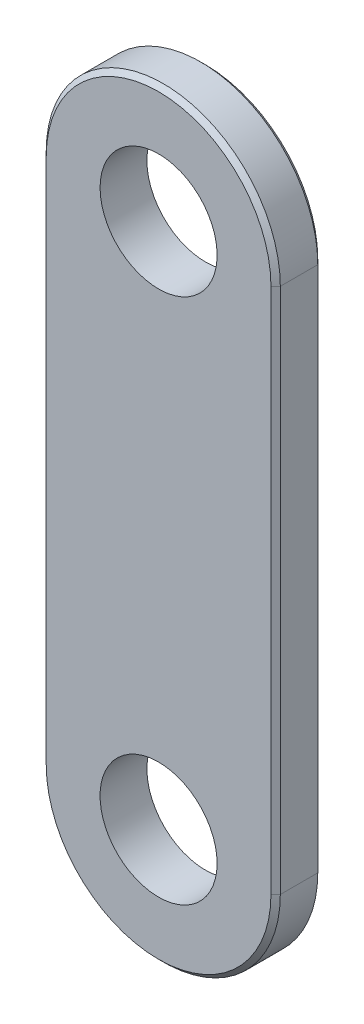
ISO-10303-21;
HEADER;
FILE_DESCRIPTION(('STEP AP214'),'2;1');
FILE_NAME('part.step','',(''),(''),'','','');
FILE_SCHEMA(('AUTOMOTIVE_DESIGN { 1 0 10303 214 1 1 1 1 }'));
ENDSEC;
DATA;
#1=APPLICATION_CONTEXT('core data for automotive mechanical design processes');
#2=APPLICATION_PROTOCOL_DEFINITION('international standard','automotive_design',2000,#1);
#3=PRODUCT_CONTEXT('',#1,'mechanical');
#4=PRODUCT('Part','Part','',(#3));
#5=PRODUCT_RELATED_PRODUCT_CATEGORY('part','',(#4));
#6=PRODUCT_DEFINITION_FORMATION('','',#4);
#7=PRODUCT_DEFINITION_CONTEXT('part definition',#1,'design');
#8=PRODUCT_DEFINITION('design','',#6,#7);
#9=PRODUCT_DEFINITION_SHAPE('','',#8);
#10=(LENGTH_UNIT() NAMED_UNIT(*) SI_UNIT(.MILLI.,.METRE.));
#11=(NAMED_UNIT(*) PLANE_ANGLE_UNIT() SI_UNIT($,.RADIAN.));
#12=(NAMED_UNIT(*) SI_UNIT($,.STERADIAN.) SOLID_ANGLE_UNIT());
#13=UNCERTAINTY_MEASURE_WITH_UNIT(LENGTH_MEASURE(1.E-05),#10,'distance_accuracy_value','');
#14=(GEOMETRIC_REPRESENTATION_CONTEXT(3) GLOBAL_UNCERTAINTY_ASSIGNED_CONTEXT((#13)) GLOBAL_UNIT_ASSIGNED_CONTEXT((#10,
#11,#12)) REPRESENTATION_CONTEXT('',''));
#15=CARTESIAN_POINT('',(0.,0.,0.));
#16=DIRECTION('',(0.,0.,1.));
#17=DIRECTION('',(1.,0.,0.));
#18=AXIS2_PLACEMENT_3D('',#15,#16,#17);
#19=CARTESIAN_POINT('',(0.,0.,-10.));
#20=DIRECTION('',(0.,0.,1.));
#21=DIRECTION('',(1.,0.,0.));
#22=AXIS2_PLACEMENT_3D('',#19,#20,#21);
#23=CYLINDRICAL_SURFACE('',#22,50.);
#24=DIRECTION('',(0.,0.,1.));
#25=VECTOR('',#24,1.);
#26=CARTESIAN_POINT('',(-50.,0.,-10.));
#27=LINE('',#26,#25);
#28=CARTESIAN_POINT('',(-50.,0.,-8.00000000000003));
#29=VERTEX_POINT('',#28);
#30=CARTESIAN_POINT('',(-50.,0.,7.99999999999996));
#31=VERTEX_POINT('',#30);
#32=EDGE_CURVE('E142',#29,#31,#27,.T.);
#33=ORIENTED_EDGE('',*,*,#32,.F.);
#34=CARTESIAN_POINT('',(0.,0.,-8.00000000000003));
#35=DIRECTION('',(0.,0.,1.));
#36=DIRECTION('',(1.,0.,0.));
#37=AXIS2_PLACEMENT_3D('',#34,#35,#36);
#38=CIRCLE('',#37,50.);
#39=CARTESIAN_POINT('',(50.,0.,-8.00000000000003));
#40=VERTEX_POINT('',#39);
#41=EDGE_CURVE('E126',#29,#40,#38,.T.);
#42=ORIENTED_EDGE('',*,*,#41,.T.);
#43=DIRECTION('',(0.,0.,1.));
#44=VECTOR('',#43,1.);
#45=CARTESIAN_POINT('',(50.,0.,-10.));
#46=LINE('',#45,#44);
#47=CARTESIAN_POINT('',(50.,0.,7.99999999999996));
#48=VERTEX_POINT('',#47);
#49=EDGE_CURVE('E165',#40,#48,#46,.T.);
#50=ORIENTED_EDGE('',*,*,#49,.T.);
#51=CARTESIAN_POINT('',(0.,0.,7.99999999999996));
#52=DIRECTION('',(0.,0.,1.));
#53=DIRECTION('',(1.,0.,0.));
#54=AXIS2_PLACEMENT_3D('',#51,#52,#53);
#55=CIRCLE('',#54,50.);
#56=EDGE_CURVE('E136',#48,#31,#55,.F.);
#57=ORIENTED_EDGE('',*,*,#56,.T.);
#58=EDGE_LOOP('',(#33,#42,#50,#57));
#59=FACE_BOUND('',#58,.T.);
#60=ADVANCED_FACE('F41',(#59),#23,.T.);
#61=CARTESIAN_POINT('',(-50.,0.,-10.));
#62=DIRECTION('',(-1.,0.,0.));
#63=DIRECTION('',(0.,0.,1.));
#64=AXIS2_PLACEMENT_3D('',#61,#62,#63);
#65=PLANE('',#64);
#66=DIRECTION('',(0.,0.,1.));
#67=VECTOR('',#66,1.);
#68=CARTESIAN_POINT('',(-50.,225.,-10.));
#69=LINE('',#68,#67);
#70=CARTESIAN_POINT('',(-50.,225.,-8.00000000000003));
#71=VERTEX_POINT('',#70);
#72=CARTESIAN_POINT('',(-50.,225.,7.99999999999996));
#73=VERTEX_POINT('',#72);
#74=EDGE_CURVE('E144',#71,#73,#69,.T.);
#75=ORIENTED_EDGE('',*,*,#74,.F.);
#76=DIRECTION('',(0.,-1.,0.));
#77=VECTOR('',#76,1.);
#78=CARTESIAN_POINT('',(-50.,0.,-8.00000000000003));
#79=LINE('',#78,#77);
#80=EDGE_CURVE('E117',#71,#29,#79,.T.);
#81=ORIENTED_EDGE('',*,*,#80,.T.);
#82=ORIENTED_EDGE('',*,*,#32,.T.);
#83=DIRECTION('',(0.,1.,0.));
#84=VECTOR('',#83,1.);
#85=CARTESIAN_POINT('',(-50.,0.,7.99999999999996));
#86=LINE('',#85,#84);
#87=EDGE_CURVE('E148',#31,#73,#86,.T.);
#88=ORIENTED_EDGE('',*,*,#87,.T.);
#89=EDGE_LOOP('',(#75,#81,#82,#88));
#90=FACE_BOUND('',#89,.T.);
#91=ADVANCED_FACE('F141',(#90),#65,.T.);
#92=CARTESIAN_POINT('',(0.,225.,-10.));
#93=DIRECTION('',(0.,0.,1.));
#94=DIRECTION('',(1.,0.,0.));
#95=AXIS2_PLACEMENT_3D('',#92,#93,#94);
#96=CYLINDRICAL_SURFACE('',#95,50.);
#97=DIRECTION('',(0.,0.,1.));
#98=VECTOR('',#97,1.);
#99=CARTESIAN_POINT('',(50.,225.,-10.));
#100=LINE('',#99,#98);
#101=CARTESIAN_POINT('',(50.,225.,-8.00000000000003));
#102=VERTEX_POINT('',#101);
#103=CARTESIAN_POINT('',(50.,225.,7.99999999999996));
#104=VERTEX_POINT('',#103);
#105=EDGE_CURVE('E156',#102,#104,#100,.T.);
#106=ORIENTED_EDGE('',*,*,#105,.F.);
#107=CARTESIAN_POINT('',(0.,225.,-8.00000000000003));
#108=DIRECTION('',(0.,0.,1.));
#109=DIRECTION('',(1.,0.,0.));
#110=AXIS2_PLACEMENT_3D('',#107,#108,#109);
#111=CIRCLE('',#110,50.);
#112=EDGE_CURVE('E182',#102,#71,#111,.T.);
#113=ORIENTED_EDGE('',*,*,#112,.T.);
#114=ORIENTED_EDGE('',*,*,#74,.T.);
#115=CARTESIAN_POINT('',(0.,225.,7.99999999999996));
#116=DIRECTION('',(0.,0.,1.));
#117=DIRECTION('',(1.,0.,0.));
#118=AXIS2_PLACEMENT_3D('',#115,#116,#117);
#119=CIRCLE('',#118,50.);
#120=EDGE_CURVE('E135',#73,#104,#119,.F.);
#121=ORIENTED_EDGE('',*,*,#120,.T.);
#122=EDGE_LOOP('',(#106,#113,#114,#121));
#123=FACE_BOUND('',#122,.T.);
#124=ADVANCED_FACE('F228',(#123),#96,.T.);
#125=CARTESIAN_POINT('',(50.,0.,-10.));
#126=DIRECTION('',(1.,0.,0.));
#127=DIRECTION('',(0.,0.,-1.));
#128=AXIS2_PLACEMENT_3D('',#125,#126,#127);
#129=PLANE('',#128);
#130=ORIENTED_EDGE('',*,*,#49,.F.);
#131=DIRECTION('',(0.,1.,0.));
#132=VECTOR('',#131,1.);
#133=CARTESIAN_POINT('',(50.,225.,-8.00000000000003));
#134=LINE('',#133,#132);
#135=EDGE_CURVE('E188',#40,#102,#134,.T.);
#136=ORIENTED_EDGE('',*,*,#135,.T.);
#137=ORIENTED_EDGE('',*,*,#105,.T.);
#138=DIRECTION('',(0.,-1.,0.));
#139=VECTOR('',#138,1.);
#140=CARTESIAN_POINT('',(50.,0.,7.99999999999996));
#141=LINE('',#140,#139);
#142=EDGE_CURVE('E185',#104,#48,#141,.T.);
#143=ORIENTED_EDGE('',*,*,#142,.T.);
#144=EDGE_LOOP('',(#130,#136,#137,#143));
#145=FACE_BOUND('',#144,.T.);
#146=ADVANCED_FACE('F231',(#145),#129,.T.);
#147=CARTESIAN_POINT('',(0.,0.,-10.));
#148=DIRECTION('',(0.,0.,1.));
#149=DIRECTION('',(1.,0.,0.));
#150=AXIS2_PLACEMENT_3D('',#147,#148,#149);
#151=PLANE('',#150);
#152=CARTESIAN_POINT('',(0.,0.,-10.));
#153=DIRECTION('',(0.,0.,1.));
#154=DIRECTION('',(1.,0.,0.));
#155=AXIS2_PLACEMENT_3D('',#152,#153,#154);
#156=CIRCLE('',#155,48.);
#157=CARTESIAN_POINT('',(48.,0.,-10.));
#158=VERTEX_POINT('',#157);
#159=CARTESIAN_POINT('',(-48.,0.,-10.));
#160=VERTEX_POINT('',#159);
#161=EDGE_CURVE('E173',#158,#160,#156,.F.);
#162=ORIENTED_EDGE('',*,*,#161,.T.);
#163=DIRECTION('',(0.,1.,0.));
#164=VECTOR('',#163,1.);
#165=CARTESIAN_POINT('',(-48.,225.,-10.));
#166=LINE('',#165,#164);
#167=CARTESIAN_POINT('',(-48.,225.,-10.));
#168=VERTEX_POINT('',#167);
#169=EDGE_CURVE('E119',#160,#168,#166,.T.);
#170=ORIENTED_EDGE('',*,*,#169,.T.);
#171=CARTESIAN_POINT('',(0.,225.,-10.));
#172=DIRECTION('',(0.,0.,1.));
#173=DIRECTION('',(1.,0.,0.));
#174=AXIS2_PLACEMENT_3D('',#171,#172,#173);
#175=CIRCLE('',#174,48.);
#176=CARTESIAN_POINT('',(48.,225.,-10.));
#177=VERTEX_POINT('',#176);
#178=EDGE_CURVE('E170',#168,#177,#175,.F.);
#179=ORIENTED_EDGE('',*,*,#178,.T.);
#180=DIRECTION('',(0.,-1.,0.));
#181=VECTOR('',#180,1.);
#182=CARTESIAN_POINT('',(48.,0.,-10.));
#183=LINE('',#182,#181);
#184=EDGE_CURVE('E147',#177,#158,#183,.T.);
#185=ORIENTED_EDGE('',*,*,#184,.T.);
#186=EDGE_LOOP('',(#162,#170,#179,#185));
#187=FACE_BOUND('',#186,.T.);
#188=CARTESIAN_POINT('',(0.,225.,-10.));
#189=DIRECTION('',(0.,0.,1.));
#190=DIRECTION('',(-1.,0.,0.));
#191=AXIS2_PLACEMENT_3D('',#188,#189,#190);
#192=CIRCLE('',#191,25.);
#193=CARTESIAN_POINT('',(-25.,225.,-10.));
#194=VERTEX_POINT('',#193);
#195=EDGE_CURVE('E249',#194,#194,#192,.T.);
#196=ORIENTED_EDGE('',*,*,#195,.T.);
#197=EDGE_LOOP('',(#196));
#198=FACE_BOUND('',#197,.T.);
#199=CARTESIAN_POINT('',(0.,0.,-10.));
#200=DIRECTION('',(0.,0.,1.));
#201=DIRECTION('',(1.,0.,0.));
#202=AXIS2_PLACEMENT_3D('',#199,#200,#201);
#203=CIRCLE('',#202,25.);
#204=CARTESIAN_POINT('',(25.,0.,-10.));
#205=VERTEX_POINT('',#204);
#206=EDGE_CURVE('E159',#205,#205,#203,.T.);
#207=ORIENTED_EDGE('',*,*,#206,.T.);
#208=EDGE_LOOP('',(#207));
#209=FACE_BOUND('',#208,.T.);
#210=ADVANCED_FACE('F241',(#187,#198,#209),#151,.F.);
#211=CARTESIAN_POINT('',(0.,0.,-10.));
#212=DIRECTION('',(0.,0.,1.));
#213=DIRECTION('',(1.,0.,0.));
#214=AXIS2_PLACEMENT_3D('',#211,#212,#213);
#215=CYLINDRICAL_SURFACE('',#214,25.);
#216=ORIENTED_EDGE('',*,*,#206,.F.);
#217=EDGE_LOOP('',(#216));
#218=FACE_BOUND('',#217,.T.);
#219=CARTESIAN_POINT('',(0.,0.,10.));
#220=DIRECTION('',(0.,0.,1.));
#221=DIRECTION('',(1.,0.,0.));
#222=AXIS2_PLACEMENT_3D('',#219,#220,#221);
#223=CIRCLE('',#222,25.);
#224=CARTESIAN_POINT('',(25.,0.,10.));
#225=VERTEX_POINT('',#224);
#226=EDGE_CURVE('E255',#225,#225,#223,.T.);
#227=ORIENTED_EDGE('',*,*,#226,.T.);
#228=EDGE_LOOP('',(#227));
#229=FACE_BOUND('',#228,.T.);
#230=ADVANCED_FACE('F244',(#218,#229),#215,.F.);
#231=CARTESIAN_POINT('',(0.,225.,-10.));
#232=DIRECTION('',(0.,0.,1.));
#233=DIRECTION('',(1.,0.,0.));
#234=AXIS2_PLACEMENT_3D('',#231,#232,#233);
#235=CYLINDRICAL_SURFACE('',#234,25.);
#236=ORIENTED_EDGE('',*,*,#195,.F.);
#237=EDGE_LOOP('',(#236));
#238=FACE_BOUND('',#237,.T.);
#239=CARTESIAN_POINT('',(0.,225.,10.));
#240=DIRECTION('',(0.,0.,1.));
#241=DIRECTION('',(-1.,0.,0.));
#242=AXIS2_PLACEMENT_3D('',#239,#240,#241);
#243=CIRCLE('',#242,25.);
#244=CARTESIAN_POINT('',(-25.,225.,10.));
#245=VERTEX_POINT('',#244);
#246=EDGE_CURVE('E206',#245,#245,#243,.T.);
#247=ORIENTED_EDGE('',*,*,#246,.T.);
#248=EDGE_LOOP('',(#247));
#249=FACE_BOUND('',#248,.T.);
#250=ADVANCED_FACE('F264',(#238,#249),#235,.F.);
#251=CARTESIAN_POINT('',(0.,0.,10.));
#252=DIRECTION('',(0.,0.,1.));
#253=DIRECTION('',(1.,0.,0.));
#254=AXIS2_PLACEMENT_3D('',#251,#252,#253);
#255=PLANE('',#254);
#256=DIRECTION('',(0.,-1.,0.));
#257=VECTOR('',#256,1.);
#258=CARTESIAN_POINT('',(-48.0000000000001,0.,10.));
#259=LINE('',#258,#257);
#260=CARTESIAN_POINT('',(-48.0000000000001,225.,10.));
#261=VERTEX_POINT('',#260);
#262=CARTESIAN_POINT('',(-48.0000000000001,0.,10.));
#263=VERTEX_POINT('',#262);
#264=EDGE_CURVE('E67',#261,#263,#259,.T.);
#265=ORIENTED_EDGE('',*,*,#264,.T.);
#266=CARTESIAN_POINT('',(0.,0.,10.));
#267=DIRECTION('',(0.,0.,1.));
#268=DIRECTION('',(1.,0.,0.));
#269=AXIS2_PLACEMENT_3D('',#266,#267,#268);
#270=CIRCLE('',#269,48.0000000000001);
#271=CARTESIAN_POINT('',(48.0000000000001,0.,10.));
#272=VERTEX_POINT('',#271);
#273=EDGE_CURVE('E11',#263,#272,#270,.T.);
#274=ORIENTED_EDGE('',*,*,#273,.T.);
#275=DIRECTION('',(0.,1.,0.));
#276=VECTOR('',#275,1.);
#277=CARTESIAN_POINT('',(48.0000000000001,0.,10.));
#278=LINE('',#277,#276);
#279=CARTESIAN_POINT('',(48.0000000000001,225.,10.));
#280=VERTEX_POINT('',#279);
#281=EDGE_CURVE('E52',#272,#280,#278,.T.);
#282=ORIENTED_EDGE('',*,*,#281,.T.);
#283=CARTESIAN_POINT('',(0.,225.,10.));
#284=DIRECTION('',(0.,0.,1.));
#285=DIRECTION('',(1.,0.,0.));
#286=AXIS2_PLACEMENT_3D('',#283,#284,#285);
#287=CIRCLE('',#286,48.0000000000001);
#288=EDGE_CURVE('E191',#280,#261,#287,.T.);
#289=ORIENTED_EDGE('',*,*,#288,.T.);
#290=EDGE_LOOP('',(#265,#274,#282,#289));
#291=FACE_BOUND('',#290,.T.);
#292=ORIENTED_EDGE('',*,*,#226,.F.);
#293=EDGE_LOOP('',(#292));
#294=FACE_BOUND('',#293,.T.);
#295=ORIENTED_EDGE('',*,*,#246,.F.);
#296=EDGE_LOOP('',(#295));
#297=FACE_BOUND('',#296,.T.);
#298=ADVANCED_FACE('F266',(#291,#294,#297),#255,.T.);
#299=CARTESIAN_POINT('',(50.,0.,-8.00000000000003));
#300=DIRECTION('',(0.707106781186547,0.,-0.707106781186547));
#301=DIRECTION('',(0.,-1.,0.));
#302=AXIS2_PLACEMENT_3D('',#299,#300,#301);
#303=PLANE('',#302);
#304=DIRECTION('',(0.707106781186547,0.,0.707106781186547));
#305=VECTOR('',#304,1.);
#306=CARTESIAN_POINT('',(48.,0.,-10.));
#307=LINE('',#306,#305);
#308=EDGE_CURVE('E129',#158,#40,#307,.T.);
#309=ORIENTED_EDGE('',*,*,#308,.F.);
#310=ORIENTED_EDGE('',*,*,#184,.F.);
#311=DIRECTION('',(-0.707106781186547,0.,-0.707106781186547));
#312=VECTOR('',#311,1.);
#313=CARTESIAN_POINT('',(50.,225.,-8.00000000000003));
#314=LINE('',#313,#312);
#315=EDGE_CURVE('E202',#102,#177,#314,.T.);
#316=ORIENTED_EDGE('',*,*,#315,.F.);
#317=ORIENTED_EDGE('',*,*,#135,.F.);
#318=EDGE_LOOP('',(#309,#310,#316,#317));
#319=FACE_BOUND('',#318,.T.);
#320=ADVANCED_FACE('F234',(#319),#303,.T.);
#321=CARTESIAN_POINT('',(0.,225.,-8.00000000000003));
#322=DIRECTION('',(0.,0.,1.));
#323=DIRECTION('',(1.,0.,0.));
#324=AXIS2_PLACEMENT_3D('',#321,#322,#323);
#325=CONICAL_SURFACE('',#324,50.,0.785398163397448);
#326=ORIENTED_EDGE('',*,*,#315,.T.);
#327=ORIENTED_EDGE('',*,*,#178,.F.);
#328=DIRECTION('',(0.707106781186547,0.,-0.707106781186547));
#329=VECTOR('',#328,1.);
#330=CARTESIAN_POINT('',(-50.,225.,-8.00000000000003));
#331=LINE('',#330,#329);
#332=EDGE_CURVE('E123',#71,#168,#331,.T.);
#333=ORIENTED_EDGE('',*,*,#332,.F.);
#334=ORIENTED_EDGE('',*,*,#112,.F.);
#335=EDGE_LOOP('',(#326,#327,#333,#334));
#336=FACE_BOUND('',#335,.T.);
#337=ADVANCED_FACE('F239',(#336),#325,.T.);
#338=CARTESIAN_POINT('',(0.,0.,-8.00000000000003));
#339=DIRECTION('',(0.,0.,1.));
#340=DIRECTION('',(1.,0.,0.));
#341=AXIS2_PLACEMENT_3D('',#338,#339,#340);
#342=CONICAL_SURFACE('',#341,50.,0.785398163397448);
#343=ORIENTED_EDGE('',*,*,#308,.T.);
#344=ORIENTED_EDGE('',*,*,#41,.F.);
#345=DIRECTION('',(-0.707106781186547,0.,0.707106781186547));
#346=VECTOR('',#345,1.);
#347=CARTESIAN_POINT('',(-48.,0.,-10.));
#348=LINE('',#347,#346);
#349=EDGE_CURVE('E113',#160,#29,#348,.T.);
#350=ORIENTED_EDGE('',*,*,#349,.F.);
#351=ORIENTED_EDGE('',*,*,#161,.F.);
#352=EDGE_LOOP('',(#343,#344,#350,#351));
#353=FACE_BOUND('',#352,.T.);
#354=ADVANCED_FACE('F127',(#353),#342,.T.);
#355=CARTESIAN_POINT('',(-50.,0.,-8.00000000000003));
#356=DIRECTION('',(-0.707106781186547,0.,-0.707106781186547));
#357=DIRECTION('',(0.,1.,0.));
#358=AXIS2_PLACEMENT_3D('',#355,#356,#357);
#359=PLANE('',#358);
#360=ORIENTED_EDGE('',*,*,#332,.T.);
#361=ORIENTED_EDGE('',*,*,#169,.F.);
#362=ORIENTED_EDGE('',*,*,#349,.T.);
#363=ORIENTED_EDGE('',*,*,#80,.F.);
#364=EDGE_LOOP('',(#360,#361,#362,#363));
#365=FACE_BOUND('',#364,.T.);
#366=ADVANCED_FACE('F115',(#365),#359,.T.);
#367=CARTESIAN_POINT('',(0.,225.,10.));
#368=DIRECTION('',(0.,0.,-1.));
#369=DIRECTION('',(-1.,0.,0.));
#370=AXIS2_PLACEMENT_3D('',#367,#368,#369);
#371=CONICAL_SURFACE('',#370,48.0000000000001,0.785398163397426);
#372=DIRECTION('',(-0.707106781186532,0.,0.707106781186564));
#373=VECTOR('',#372,1.);
#374=CARTESIAN_POINT('',(50.,225.,7.99999999999996));
#375=LINE('',#374,#373);
#376=EDGE_CURVE('E211',#104,#280,#375,.T.);
#377=ORIENTED_EDGE('',*,*,#376,.F.);
#378=ORIENTED_EDGE('',*,*,#120,.F.);
#379=DIRECTION('',(-0.707106781186532,0.,-0.707106781186564));
#380=VECTOR('',#379,1.);
#381=CARTESIAN_POINT('',(-48.0000000000001,225.,10.));
#382=LINE('',#381,#380);
#383=EDGE_CURVE('E46',#261,#73,#382,.T.);
#384=ORIENTED_EDGE('',*,*,#383,.F.);
#385=ORIENTED_EDGE('',*,*,#288,.F.);
#386=EDGE_LOOP('',(#377,#378,#384,#385));
#387=FACE_BOUND('',#386,.T.);
#388=ADVANCED_FACE('F44',(#387),#371,.T.);
#389=CARTESIAN_POINT('',(-48.0000000000001,0.,10.));
#390=DIRECTION('',(0.707106781186564,0.,-0.707106781186532));
#391=DIRECTION('',(0.,-1.,0.));
#392=AXIS2_PLACEMENT_3D('',#389,#390,#391);
#393=PLANE('',#392);
#394=ORIENTED_EDGE('',*,*,#383,.T.);
#395=ORIENTED_EDGE('',*,*,#87,.F.);
#396=DIRECTION('',(-0.707106781186532,0.,-0.707106781186564));
#397=VECTOR('',#396,1.);
#398=CARTESIAN_POINT('',(-48.0000000000001,0.,10.));
#399=LINE('',#398,#397);
#400=EDGE_CURVE('E209',#263,#31,#399,.T.);
#401=ORIENTED_EDGE('',*,*,#400,.F.);
#402=ORIENTED_EDGE('',*,*,#264,.F.);
#403=EDGE_LOOP('',(#394,#395,#401,#402));
#404=FACE_BOUND('',#403,.T.);
#405=ADVANCED_FACE('F222',(#404),#393,.F.);
#406=CARTESIAN_POINT('',(48.0000000000001,0.,10.));
#407=DIRECTION('',(-0.707106781186564,0.,-0.707106781186532));
#408=DIRECTION('',(0.,1.,0.));
#409=AXIS2_PLACEMENT_3D('',#406,#407,#408);
#410=PLANE('',#409);
#411=ORIENTED_EDGE('',*,*,#376,.T.);
#412=ORIENTED_EDGE('',*,*,#281,.F.);
#413=DIRECTION('',(-0.707106781186532,0.,0.707106781186564));
#414=VECTOR('',#413,1.);
#415=CARTESIAN_POINT('',(50.,0.,7.99999999999996));
#416=LINE('',#415,#414);
#417=EDGE_CURVE('E60',#48,#272,#416,.T.);
#418=ORIENTED_EDGE('',*,*,#417,.F.);
#419=ORIENTED_EDGE('',*,*,#142,.F.);
#420=EDGE_LOOP('',(#411,#412,#418,#419));
#421=FACE_BOUND('',#420,.T.);
#422=ADVANCED_FACE('F311',(#421),#410,.F.);
#423=CARTESIAN_POINT('',(0.,0.,10.));
#424=DIRECTION('',(0.,0.,-1.));
#425=DIRECTION('',(-1.,0.,0.));
#426=AXIS2_PLACEMENT_3D('',#423,#424,#425);
#427=CONICAL_SURFACE('',#426,48.0000000000001,0.785398163397426);
#428=ORIENTED_EDGE('',*,*,#400,.T.);
#429=ORIENTED_EDGE('',*,*,#56,.F.);
#430=ORIENTED_EDGE('',*,*,#417,.T.);
#431=ORIENTED_EDGE('',*,*,#273,.F.);
#432=EDGE_LOOP('',(#428,#429,#430,#431));
#433=FACE_BOUND('',#432,.T.);
#434=ADVANCED_FACE('F305',(#433),#427,.T.);
#435=CLOSED_SHELL('',(#60,#91,#124,#146,#210,#230,#250,#298,#320,#337,#354,#366,#388,#405,#422,#434));
#436=MANIFOLD_SOLID_BREP('B2',#435);
#437=ADVANCED_BREP_SHAPE_REPRESENTATION('',(#18,#436),#14);
#438=SHAPE_DEFINITION_REPRESENTATION(#9,#437);
ENDSEC;
END-ISO-10303-21;
